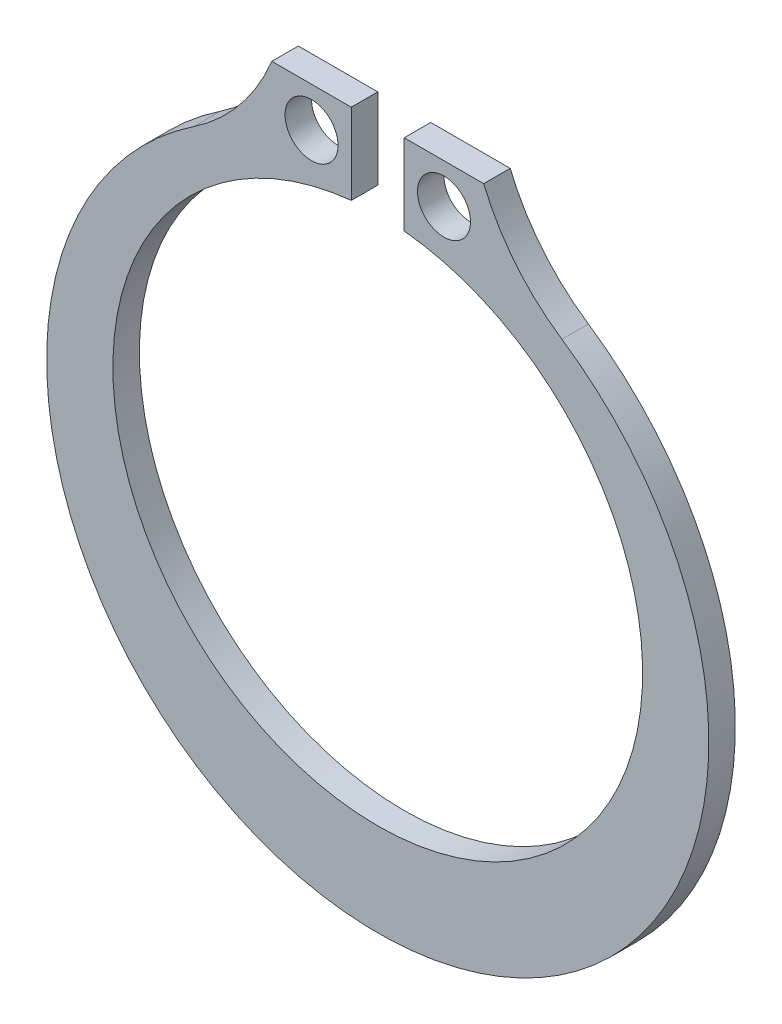
ISO-10303-21;
HEADER;
FILE_DESCRIPTION(('STEP AP214'),'2;1');
FILE_NAME('part.step','',(''),(''),'','','');
FILE_SCHEMA(('AUTOMOTIVE_DESIGN { 1 0 10303 214 1 1 1 1 }'));
ENDSEC;
DATA;
#1=APPLICATION_CONTEXT('core data for automotive mechanical design processes');
#2=APPLICATION_PROTOCOL_DEFINITION('international standard','automotive_design',2000,#1);
#3=PRODUCT_CONTEXT('',#1,'mechanical');
#4=PRODUCT('Part','Part','',(#3));
#5=PRODUCT_RELATED_PRODUCT_CATEGORY('part','',(#4));
#6=PRODUCT_DEFINITION_FORMATION('','',#4);
#7=PRODUCT_DEFINITION_CONTEXT('part definition',#1,'design');
#8=PRODUCT_DEFINITION('design','',#6,#7);
#9=PRODUCT_DEFINITION_SHAPE('','',#8);
#10=(LENGTH_UNIT() NAMED_UNIT(*) SI_UNIT(.MILLI.,.METRE.));
#11=(NAMED_UNIT(*) PLANE_ANGLE_UNIT() SI_UNIT($,.RADIAN.));
#12=(NAMED_UNIT(*) SI_UNIT($,.STERADIAN.) SOLID_ANGLE_UNIT());
#13=UNCERTAINTY_MEASURE_WITH_UNIT(LENGTH_MEASURE(1.E-05),#10,'distance_accuracy_value','');
#14=(GEOMETRIC_REPRESENTATION_CONTEXT(3) GLOBAL_UNCERTAINTY_ASSIGNED_CONTEXT((#13)) GLOBAL_UNIT_ASSIGNED_CONTEXT((#10,
#11,#12)) REPRESENTATION_CONTEXT('',''));
#15=CARTESIAN_POINT('',(0.,0.,0.));
#16=DIRECTION('',(0.,0.,1.));
#17=DIRECTION('',(1.,0.,0.));
#18=AXIS2_PLACEMENT_3D('',#15,#16,#17);
#19=CARTESIAN_POINT('',(-11.4010404379863,17.0372027320039,1.));
#20=DIRECTION('',(0.,0.,-1.));
#21=DIRECTION('',(-1.,0.,0.));
#22=AXIS2_PLACEMENT_3D('',#19,#20,#21);
#23=PLANE('',#22);
#24=CARTESIAN_POINT('',(-11.4010404379863,17.0372027320039,1.));
#25=DIRECTION('',(0.,0.,-1.));
#26=DIRECTION('',(-1.,0.,0.));
#27=AXIS2_PLACEMENT_3D('',#24,#25,#26);
#28=CIRCLE('',#27,8.);
#29=CARTESIAN_POINT('',(-4.,14.,1.));
#30=VERTEX_POINT('',#29);
#31=CARTESIAN_POINT('',(-6.95185392560138,10.3885382512219,1.));
#32=VERTEX_POINT('',#31);
#33=EDGE_CURVE('E170',#30,#32,#28,.T.);
#34=ORIENTED_EDGE('',*,*,#33,.T.);
#35=CARTESIAN_POINT('',(0.,0.,1.));
#36=DIRECTION('',(0.,0.,1.));
#37=DIRECTION('',(1.,0.,0.));
#38=AXIS2_PLACEMENT_3D('',#35,#36,#37);
#39=CIRCLE('',#38,12.5);
#40=CARTESIAN_POINT('',(6.95185392560138,10.3885382512219,1.));
#41=VERTEX_POINT('',#40);
#42=EDGE_CURVE('E106',#32,#41,#39,.T.);
#43=ORIENTED_EDGE('',*,*,#42,.T.);
#44=CARTESIAN_POINT('',(11.4010404379863,17.0372027320039,1.));
#45=DIRECTION('',(0.,0.,-1.));
#46=DIRECTION('',(1.,0.,0.));
#47=AXIS2_PLACEMENT_3D('',#44,#45,#46);
#48=CIRCLE('',#47,8.);
#49=CARTESIAN_POINT('',(4.,14.,1.));
#50=VERTEX_POINT('',#49);
#51=EDGE_CURVE('E191',#41,#50,#48,.T.);
#52=ORIENTED_EDGE('',*,*,#51,.T.);
#53=DIRECTION('',(-1.,0.,0.));
#54=VECTOR('',#53,1.);
#55=CARTESIAN_POINT('',(4.,14.,1.));
#56=LINE('',#55,#54);
#57=CARTESIAN_POINT('',(1.,14.,1.));
#58=VERTEX_POINT('',#57);
#59=EDGE_CURVE('E205',#50,#58,#56,.T.);
#60=ORIENTED_EDGE('',*,*,#59,.T.);
#61=DIRECTION('',(0.,-1.,0.));
#62=VECTOR('',#61,1.);
#63=CARTESIAN_POINT('',(1.,14.,1.));
#64=LINE('',#63,#62);
#65=CARTESIAN_POINT('',(1.,10.9498743710662,1.));
#66=VERTEX_POINT('',#65);
#67=EDGE_CURVE('E125',#58,#66,#64,.T.);
#68=ORIENTED_EDGE('',*,*,#67,.T.);
#69=CARTESIAN_POINT('',(0.,1.,1.));
#70=DIRECTION('',(0.,0.,-1.));
#71=DIRECTION('',(1.,0.,0.));
#72=AXIS2_PLACEMENT_3D('',#69,#70,#71);
#73=CIRCLE('',#72,10.);
#74=CARTESIAN_POINT('',(-1.,10.9498743710662,1.));
#75=VERTEX_POINT('',#74);
#76=EDGE_CURVE('E119',#66,#75,#73,.T.);
#77=ORIENTED_EDGE('',*,*,#76,.T.);
#78=DIRECTION('',(0.,1.,0.));
#79=VECTOR('',#78,1.);
#80=CARTESIAN_POINT('',(-1.,14.,1.));
#81=LINE('',#80,#79);
#82=CARTESIAN_POINT('',(-1.,14.,1.));
#83=VERTEX_POINT('',#82);
#84=EDGE_CURVE('E123',#75,#83,#81,.T.);
#85=ORIENTED_EDGE('',*,*,#84,.T.);
#86=DIRECTION('',(-1.,0.,0.));
#87=VECTOR('',#86,1.);
#88=CARTESIAN_POINT('',(-4.,14.,1.));
#89=LINE('',#88,#87);
#90=EDGE_CURVE('E63',#83,#30,#89,.T.);
#91=ORIENTED_EDGE('',*,*,#90,.T.);
#92=EDGE_LOOP('',(#34,#43,#52,#60,#68,#77,#85,#91));
#93=FACE_BOUND('',#92,.T.);
#94=CARTESIAN_POINT('',(-2.5,12.5,1.));
#95=DIRECTION('',(0.,0.,1.));
#96=DIRECTION('',(1.,0.,0.));
#97=AXIS2_PLACEMENT_3D('',#94,#95,#96);
#98=CIRCLE('',#97,1.);
#99=CARTESIAN_POINT('',(-1.5,12.5,1.));
#100=VERTEX_POINT('',#99);
#101=EDGE_CURVE('E152',#100,#100,#98,.T.);
#102=ORIENTED_EDGE('',*,*,#101,.F.);
#103=EDGE_LOOP('',(#102));
#104=FACE_BOUND('',#103,.T.);
#105=CARTESIAN_POINT('',(2.5,12.5,1.));
#106=DIRECTION('',(0.,0.,1.));
#107=DIRECTION('',(-1.,0.,0.));
#108=AXIS2_PLACEMENT_3D('',#105,#106,#107);
#109=CIRCLE('',#108,1.);
#110=CARTESIAN_POINT('',(1.5,12.5,1.));
#111=VERTEX_POINT('',#110);
#112=EDGE_CURVE('E219',#111,#111,#109,.T.);
#113=ORIENTED_EDGE('',*,*,#112,.F.);
#114=EDGE_LOOP('',(#113));
#115=FACE_BOUND('',#114,.T.);
#116=ADVANCED_FACE('F45',(#93,#104,#115),#23,.F.);
#117=CARTESIAN_POINT('',(-11.4010404379863,17.0372027320039,0.));
#118=DIRECTION('',(0.,0.,-1.));
#119=DIRECTION('',(-1.,0.,0.));
#120=AXIS2_PLACEMENT_3D('',#117,#118,#119);
#121=PLANE('',#120);
#122=CARTESIAN_POINT('',(-2.5,12.5,0.));
#123=DIRECTION('',(0.,0.,1.));
#124=DIRECTION('',(1.,0.,0.));
#125=AXIS2_PLACEMENT_3D('',#122,#123,#124);
#126=CIRCLE('',#125,1.);
#127=CARTESIAN_POINT('',(-1.5,12.5,0.));
#128=VERTEX_POINT('',#127);
#129=EDGE_CURVE('E215',#128,#128,#126,.T.);
#130=ORIENTED_EDGE('',*,*,#129,.T.);
#131=EDGE_LOOP('',(#130));
#132=FACE_BOUND('',#131,.T.);
#133=CARTESIAN_POINT('',(-11.4010404379863,17.0372027320039,0.));
#134=DIRECTION('',(0.,0.,-1.));
#135=DIRECTION('',(-1.,0.,0.));
#136=AXIS2_PLACEMENT_3D('',#133,#134,#135);
#137=CIRCLE('',#136,8.);
#138=CARTESIAN_POINT('',(-4.,14.,0.));
#139=VERTEX_POINT('',#138);
#140=CARTESIAN_POINT('',(-6.95185392560138,10.3885382512219,0.));
#141=VERTEX_POINT('',#140);
#142=EDGE_CURVE('E147',#139,#141,#137,.T.);
#143=ORIENTED_EDGE('',*,*,#142,.F.);
#144=DIRECTION('',(-1.,0.,0.));
#145=VECTOR('',#144,1.);
#146=CARTESIAN_POINT('',(-4.,14.,0.));
#147=LINE('',#146,#145);
#148=CARTESIAN_POINT('',(-1.,14.,0.));
#149=VERTEX_POINT('',#148);
#150=EDGE_CURVE('E98',#149,#139,#147,.T.);
#151=ORIENTED_EDGE('',*,*,#150,.F.);
#152=DIRECTION('',(0.,1.,0.));
#153=VECTOR('',#152,1.);
#154=CARTESIAN_POINT('',(-1.,14.,0.));
#155=LINE('',#154,#153);
#156=CARTESIAN_POINT('',(-1.,10.9498743710662,0.));
#157=VERTEX_POINT('',#156);
#158=EDGE_CURVE('E92',#157,#149,#155,.T.);
#159=ORIENTED_EDGE('',*,*,#158,.F.);
#160=CARTESIAN_POINT('',(0.,1.,0.));
#161=DIRECTION('',(0.,0.,-1.));
#162=DIRECTION('',(1.,0.,0.));
#163=AXIS2_PLACEMENT_3D('',#160,#161,#162);
#164=CIRCLE('',#163,10.);
#165=CARTESIAN_POINT('',(1.,10.9498743710662,0.));
#166=VERTEX_POINT('',#165);
#167=EDGE_CURVE('E134',#166,#157,#164,.T.);
#168=ORIENTED_EDGE('',*,*,#167,.F.);
#169=DIRECTION('',(0.,-1.,0.));
#170=VECTOR('',#169,1.);
#171=CARTESIAN_POINT('',(1.,14.,0.));
#172=LINE('',#171,#170);
#173=CARTESIAN_POINT('',(1.,14.,0.));
#174=VERTEX_POINT('',#173);
#175=EDGE_CURVE('E161',#174,#166,#172,.T.);
#176=ORIENTED_EDGE('',*,*,#175,.F.);
#177=DIRECTION('',(-1.,0.,0.));
#178=VECTOR('',#177,1.);
#179=CARTESIAN_POINT('',(4.,14.,0.));
#180=LINE('',#179,#178);
#181=CARTESIAN_POINT('',(4.,14.,0.));
#182=VERTEX_POINT('',#181);
#183=EDGE_CURVE('E158',#182,#174,#180,.T.);
#184=ORIENTED_EDGE('',*,*,#183,.F.);
#185=CARTESIAN_POINT('',(11.4010404379863,17.0372027320039,0.));
#186=DIRECTION('',(0.,0.,-1.));
#187=DIRECTION('',(1.,0.,0.));
#188=AXIS2_PLACEMENT_3D('',#185,#186,#187);
#189=CIRCLE('',#188,8.);
#190=CARTESIAN_POINT('',(6.95185392560138,10.3885382512219,0.));
#191=VERTEX_POINT('',#190);
#192=EDGE_CURVE('E155',#191,#182,#189,.T.);
#193=ORIENTED_EDGE('',*,*,#192,.F.);
#194=CARTESIAN_POINT('',(0.,0.,0.));
#195=DIRECTION('',(0.,0.,1.));
#196=DIRECTION('',(1.,0.,0.));
#197=AXIS2_PLACEMENT_3D('',#194,#195,#196);
#198=CIRCLE('',#197,12.5);
#199=EDGE_CURVE('E151',#141,#191,#198,.T.);
#200=ORIENTED_EDGE('',*,*,#199,.F.);
#201=EDGE_LOOP('',(#143,#151,#159,#168,#176,#184,#193,#200));
#202=FACE_BOUND('',#201,.T.);
#203=CARTESIAN_POINT('',(2.5,12.5,0.));
#204=DIRECTION('',(0.,0.,1.));
#205=DIRECTION('',(-1.,0.,0.));
#206=AXIS2_PLACEMENT_3D('',#203,#204,#205);
#207=CIRCLE('',#206,1.);
#208=CARTESIAN_POINT('',(1.5,12.5,0.));
#209=VERTEX_POINT('',#208);
#210=EDGE_CURVE('E223',#209,#209,#207,.T.);
#211=ORIENTED_EDGE('',*,*,#210,.T.);
#212=EDGE_LOOP('',(#211));
#213=FACE_BOUND('',#212,.T.);
#214=ADVANCED_FACE('F195',(#132,#202,#213),#121,.T.);
#215=CARTESIAN_POINT('',(-11.4010404379863,17.0372027320039,1.));
#216=DIRECTION('',(0.,0.,-1.));
#217=DIRECTION('',(-1.,0.,0.));
#218=AXIS2_PLACEMENT_3D('',#215,#216,#217);
#219=CYLINDRICAL_SURFACE('',#218,8.);
#220=ORIENTED_EDGE('',*,*,#142,.T.);
#221=DIRECTION('',(0.,0.,-1.));
#222=VECTOR('',#221,1.);
#223=CARTESIAN_POINT('',(-6.95185392560138,10.3885382512219,1.));
#224=LINE('',#223,#222);
#225=EDGE_CURVE('E11',#32,#141,#224,.T.);
#226=ORIENTED_EDGE('',*,*,#225,.F.);
#227=ORIENTED_EDGE('',*,*,#33,.F.);
#228=DIRECTION('',(0.,0.,-1.));
#229=VECTOR('',#228,1.);
#230=CARTESIAN_POINT('',(-4.,14.,1.));
#231=LINE('',#230,#229);
#232=EDGE_CURVE('E143',#30,#139,#231,.T.);
#233=ORIENTED_EDGE('',*,*,#232,.T.);
#234=EDGE_LOOP('',(#220,#226,#227,#233));
#235=FACE_BOUND('',#234,.T.);
#236=ADVANCED_FACE('F47',(#235),#219,.F.);
#237=CARTESIAN_POINT('',(0.,0.,1.));
#238=DIRECTION('',(0.,0.,-1.));
#239=DIRECTION('',(-1.,0.,0.));
#240=AXIS2_PLACEMENT_3D('',#237,#238,#239);
#241=CYLINDRICAL_SURFACE('',#240,12.5);
#242=ORIENTED_EDGE('',*,*,#199,.T.);
#243=DIRECTION('',(0.,0.,-1.));
#244=VECTOR('',#243,1.);
#245=CARTESIAN_POINT('',(6.95185392560138,10.3885382512219,1.));
#246=LINE('',#245,#244);
#247=EDGE_CURVE('E55',#41,#191,#246,.T.);
#248=ORIENTED_EDGE('',*,*,#247,.F.);
#249=ORIENTED_EDGE('',*,*,#42,.F.);
#250=ORIENTED_EDGE('',*,*,#225,.T.);
#251=EDGE_LOOP('',(#242,#248,#249,#250));
#252=FACE_BOUND('',#251,.T.);
#253=ADVANCED_FACE('F257',(#252),#241,.T.);
#254=CARTESIAN_POINT('',(11.4010404379863,17.0372027320039,1.));
#255=DIRECTION('',(0.,0.,-1.));
#256=DIRECTION('',(-1.,0.,0.));
#257=AXIS2_PLACEMENT_3D('',#254,#255,#256);
#258=CYLINDRICAL_SURFACE('',#257,8.);
#259=ORIENTED_EDGE('',*,*,#192,.T.);
#260=DIRECTION('',(0.,0.,-1.));
#261=VECTOR('',#260,1.);
#262=CARTESIAN_POINT('',(4.,14.,1.));
#263=LINE('',#262,#261);
#264=EDGE_CURVE('E181',#50,#182,#263,.T.);
#265=ORIENTED_EDGE('',*,*,#264,.F.);
#266=ORIENTED_EDGE('',*,*,#51,.F.);
#267=ORIENTED_EDGE('',*,*,#247,.T.);
#268=EDGE_LOOP('',(#259,#265,#266,#267));
#269=FACE_BOUND('',#268,.T.);
#270=ADVANCED_FACE('F189',(#269),#258,.F.);
#271=CARTESIAN_POINT('',(4.,14.,1.));
#272=DIRECTION('',(0.,-1.,0.));
#273=DIRECTION('',(0.,0.,-1.));
#274=AXIS2_PLACEMENT_3D('',#271,#272,#273);
#275=PLANE('',#274);
#276=ORIENTED_EDGE('',*,*,#183,.T.);
#277=DIRECTION('',(0.,0.,-1.));
#278=VECTOR('',#277,1.);
#279=CARTESIAN_POINT('',(1.,14.,1.));
#280=LINE('',#279,#278);
#281=EDGE_CURVE('E177',#58,#174,#280,.T.);
#282=ORIENTED_EDGE('',*,*,#281,.F.);
#283=ORIENTED_EDGE('',*,*,#59,.F.);
#284=ORIENTED_EDGE('',*,*,#264,.T.);
#285=EDGE_LOOP('',(#276,#282,#283,#284));
#286=FACE_BOUND('',#285,.T.);
#287=ADVANCED_FACE('F200',(#286),#275,.F.);
#288=CARTESIAN_POINT('',(1.,14.,1.));
#289=DIRECTION('',(1.,0.,0.));
#290=DIRECTION('',(0.,0.,-1.));
#291=AXIS2_PLACEMENT_3D('',#288,#289,#290);
#292=PLANE('',#291);
#293=ORIENTED_EDGE('',*,*,#175,.T.);
#294=DIRECTION('',(0.,0.,-1.));
#295=VECTOR('',#294,1.);
#296=CARTESIAN_POINT('',(1.,10.9498743710662,1.));
#297=LINE('',#296,#295);
#298=EDGE_CURVE('E136',#66,#166,#297,.T.);
#299=ORIENTED_EDGE('',*,*,#298,.F.);
#300=ORIENTED_EDGE('',*,*,#67,.F.);
#301=ORIENTED_EDGE('',*,*,#281,.T.);
#302=EDGE_LOOP('',(#293,#299,#300,#301));
#303=FACE_BOUND('',#302,.T.);
#304=ADVANCED_FACE('F203',(#303),#292,.F.);
#305=CARTESIAN_POINT('',(0.,1.,1.));
#306=DIRECTION('',(0.,0.,-1.));
#307=DIRECTION('',(-1.,0.,0.));
#308=AXIS2_PLACEMENT_3D('',#305,#306,#307);
#309=CYLINDRICAL_SURFACE('',#308,10.);
#310=ORIENTED_EDGE('',*,*,#167,.T.);
#311=DIRECTION('',(0.,0.,-1.));
#312=VECTOR('',#311,1.);
#313=CARTESIAN_POINT('',(-1.,10.9498743710662,1.));
#314=LINE('',#313,#312);
#315=EDGE_CURVE('E131',#75,#157,#314,.T.);
#316=ORIENTED_EDGE('',*,*,#315,.F.);
#317=ORIENTED_EDGE('',*,*,#76,.F.);
#318=ORIENTED_EDGE('',*,*,#298,.T.);
#319=EDGE_LOOP('',(#310,#316,#317,#318));
#320=FACE_BOUND('',#319,.T.);
#321=ADVANCED_FACE('F132',(#320),#309,.F.);
#322=CARTESIAN_POINT('',(-1.,14.,1.));
#323=DIRECTION('',(-1.,0.,0.));
#324=DIRECTION('',(0.,0.,1.));
#325=AXIS2_PLACEMENT_3D('',#322,#323,#324);
#326=PLANE('',#325);
#327=ORIENTED_EDGE('',*,*,#158,.T.);
#328=DIRECTION('',(0.,0.,-1.));
#329=VECTOR('',#328,1.);
#330=CARTESIAN_POINT('',(-1.,14.,1.));
#331=LINE('',#330,#329);
#332=EDGE_CURVE('E137',#83,#149,#331,.T.);
#333=ORIENTED_EDGE('',*,*,#332,.F.);
#334=ORIENTED_EDGE('',*,*,#84,.F.);
#335=ORIENTED_EDGE('',*,*,#315,.T.);
#336=EDGE_LOOP('',(#327,#333,#334,#335));
#337=FACE_BOUND('',#336,.T.);
#338=ADVANCED_FACE('F139',(#337),#326,.F.);
#339=CARTESIAN_POINT('',(-4.,14.,1.));
#340=DIRECTION('',(0.,-1.,0.));
#341=DIRECTION('',(0.,0.,-1.));
#342=AXIS2_PLACEMENT_3D('',#339,#340,#341);
#343=PLANE('',#342);
#344=ORIENTED_EDGE('',*,*,#150,.T.);
#345=ORIENTED_EDGE('',*,*,#232,.F.);
#346=ORIENTED_EDGE('',*,*,#90,.F.);
#347=ORIENTED_EDGE('',*,*,#332,.T.);
#348=EDGE_LOOP('',(#344,#345,#346,#347));
#349=FACE_BOUND('',#348,.T.);
#350=ADVANCED_FACE('F245',(#349),#343,.F.);
#351=CARTESIAN_POINT('',(-2.5,12.5,1.));
#352=DIRECTION('',(0.,0.,-1.));
#353=DIRECTION('',(-1.,0.,0.));
#354=AXIS2_PLACEMENT_3D('',#351,#352,#353);
#355=CYLINDRICAL_SURFACE('',#354,1.);
#356=ORIENTED_EDGE('',*,*,#101,.T.);
#357=EDGE_LOOP('',(#356));
#358=FACE_BOUND('',#357,.T.);
#359=ORIENTED_EDGE('',*,*,#129,.F.);
#360=EDGE_LOOP('',(#359));
#361=FACE_BOUND('',#360,.T.);
#362=ADVANCED_FACE('F242',(#358,#361),#355,.F.);
#363=CARTESIAN_POINT('',(2.5,12.5,1.));
#364=DIRECTION('',(0.,0.,-1.));
#365=DIRECTION('',(-1.,0.,0.));
#366=AXIS2_PLACEMENT_3D('',#363,#364,#365);
#367=CYLINDRICAL_SURFACE('',#366,1.);
#368=ORIENTED_EDGE('',*,*,#112,.T.);
#369=EDGE_LOOP('',(#368));
#370=FACE_BOUND('',#369,.T.);
#371=ORIENTED_EDGE('',*,*,#210,.F.);
#372=EDGE_LOOP('',(#371));
#373=FACE_BOUND('',#372,.T.);
#374=ADVANCED_FACE('F231',(#370,#373),#367,.F.);
#375=CLOSED_SHELL('',(#116,#214,#236,#253,#270,#287,#304,#321,#338,#350,#362,#374));
#376=MANIFOLD_SOLID_BREP('B2',#375);
#377=ADVANCED_BREP_SHAPE_REPRESENTATION('',(#18,#376),#14);
#378=SHAPE_DEFINITION_REPRESENTATION(#9,#377);
ENDSEC;
END-ISO-10303-21;
